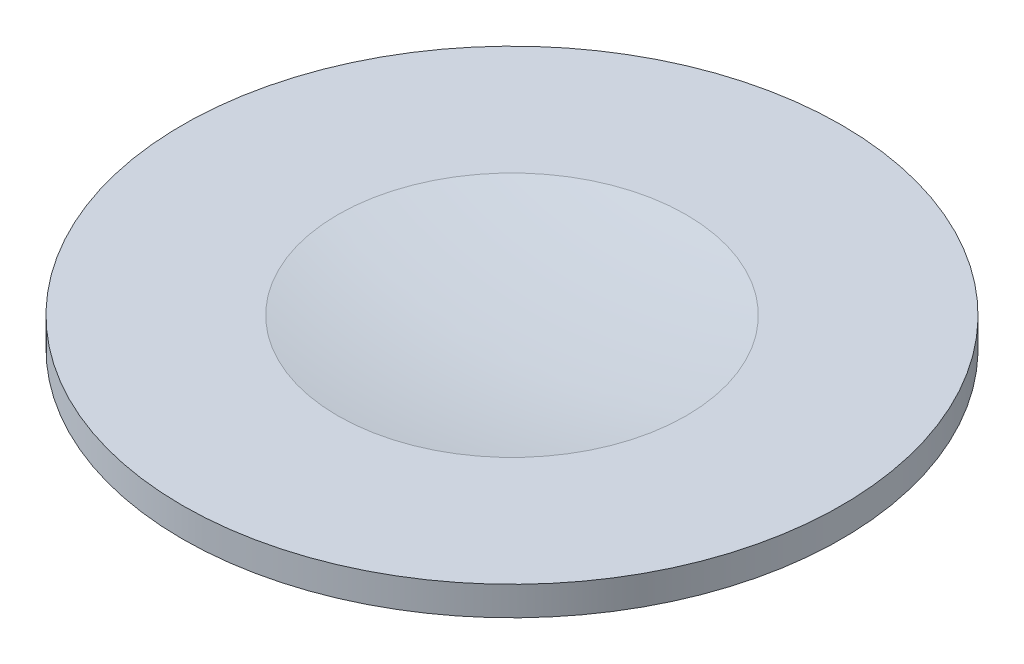
ISO-10303-21;
HEADER;
FILE_DESCRIPTION(('STEP AP214'),'2;1');
FILE_NAME('part.step','',(''),(''),'','','');
FILE_SCHEMA(('AUTOMOTIVE_DESIGN { 1 0 10303 214 1 1 1 1 }'));
ENDSEC;
DATA;
#1=APPLICATION_CONTEXT('core data for automotive mechanical design processes');
#2=APPLICATION_PROTOCOL_DEFINITION('international standard','automotive_design',2000,#1);
#3=PRODUCT_CONTEXT('',#1,'mechanical');
#4=PRODUCT('Part','Part','',(#3));
#5=PRODUCT_RELATED_PRODUCT_CATEGORY('part','',(#4));
#6=PRODUCT_DEFINITION_FORMATION('','',#4);
#7=PRODUCT_DEFINITION_CONTEXT('part definition',#1,'design');
#8=PRODUCT_DEFINITION('design','',#6,#7);
#9=PRODUCT_DEFINITION_SHAPE('','',#8);
#10=(LENGTH_UNIT() NAMED_UNIT(*) SI_UNIT(.MILLI.,.METRE.));
#11=(NAMED_UNIT(*) PLANE_ANGLE_UNIT() SI_UNIT($,.RADIAN.));
#12=(NAMED_UNIT(*) SI_UNIT($,.STERADIAN.) SOLID_ANGLE_UNIT());
#13=UNCERTAINTY_MEASURE_WITH_UNIT(LENGTH_MEASURE(1.E-05),#10,'distance_accuracy_value','');
#14=(GEOMETRIC_REPRESENTATION_CONTEXT(3) GLOBAL_UNCERTAINTY_ASSIGNED_CONTEXT((#13)) GLOBAL_UNIT_ASSIGNED_CONTEXT((#10,
#11,#12)) REPRESENTATION_CONTEXT('',''));
#15=CARTESIAN_POINT('',(0.,0.,0.));
#16=DIRECTION('',(0.,0.,1.));
#17=DIRECTION('',(1.,0.,0.));
#18=AXIS2_PLACEMENT_3D('',#15,#16,#17);
#19=CARTESIAN_POINT('',(0.,1.,0.));
#20=DIRECTION('',(0.,-1.,0.));
#21=DIRECTION('',(0.,0.,-1.));
#22=AXIS2_PLACEMENT_3D('',#19,#20,#21);
#23=CYLINDRICAL_SURFACE('',#22,11.35);
#24=CARTESIAN_POINT('',(0.,1.,0.));
#25=DIRECTION('',(0.,1.,0.));
#26=DIRECTION('',(0.,0.,1.));
#27=AXIS2_PLACEMENT_3D('',#24,#25,#26);
#28=CIRCLE('',#27,11.35);
#29=CARTESIAN_POINT('',(0.,1.,11.35));
#30=VERTEX_POINT('',#29);
#31=EDGE_CURVE('E10',#30,#30,#28,.T.);
#32=ORIENTED_EDGE('',*,*,#31,.F.);
#33=EDGE_LOOP('',(#32));
#34=FACE_BOUND('',#33,.T.);
#35=CARTESIAN_POINT('',(0.,0.,0.));
#36=DIRECTION('',(0.,1.,0.));
#37=DIRECTION('',(0.,0.,1.));
#38=AXIS2_PLACEMENT_3D('',#35,#36,#37);
#39=CIRCLE('',#38,11.35);
#40=CARTESIAN_POINT('',(0.,0.,11.35));
#41=VERTEX_POINT('',#40);
#42=EDGE_CURVE('E42',#41,#41,#39,.T.);
#43=ORIENTED_EDGE('',*,*,#42,.T.);
#44=EDGE_LOOP('',(#43));
#45=FACE_BOUND('',#44,.T.);
#46=ADVANCED_FACE('F39',(#34,#45),#23,.T.);
#47=CARTESIAN_POINT('',(0.,1.,0.));
#48=DIRECTION('',(0.,1.,0.));
#49=DIRECTION('',(0.,0.,1.));
#50=AXIS2_PLACEMENT_3D('',#47,#48,#49);
#51=PLANE('',#50);
#52=CARTESIAN_POINT('',(0.,1.,0.));
#53=DIRECTION('',(0.,1.,0.));
#54=DIRECTION('',(0.,0.,1.));
#55=AXIS2_PLACEMENT_3D('',#52,#53,#54);
#56=CIRCLE('',#55,6.);
#57=CARTESIAN_POINT('',(0.,1.,6.));
#58=VERTEX_POINT('',#57);
#59=EDGE_CURVE('E49',#58,#58,#56,.T.);
#60=ORIENTED_EDGE('',*,*,#59,.F.);
#61=EDGE_LOOP('',(#60));
#62=FACE_BOUND('',#61,.T.);
#63=ORIENTED_EDGE('',*,*,#31,.T.);
#64=EDGE_LOOP('',(#63));
#65=FACE_BOUND('',#64,.T.);
#66=ADVANCED_FACE('F56',(#62,#65),#51,.T.);
#67=CARTESIAN_POINT('',(0.,0.,0.));
#68=DIRECTION('',(0.,1.,0.));
#69=DIRECTION('',(0.,0.,1.));
#70=AXIS2_PLACEMENT_3D('',#67,#68,#69);
#71=PLANE('',#70);
#72=ORIENTED_EDGE('',*,*,#42,.F.);
#73=EDGE_LOOP('',(#72));
#74=FACE_BOUND('',#73,.T.);
#75=ADVANCED_FACE('F58',(#74),#71,.F.);
#76=CARTESIAN_POINT('',(0.,35.4818792991333,0.));
#77=DIRECTION('',(0.,1.,0.));
#78=DIRECTION('',(1.,0.,0.));
#79=AXIS2_PLACEMENT_3D('',#76,#77,#78);
#80=SPHERICAL_SURFACE('',#79,35.);
#81=ORIENTED_EDGE('',*,*,#59,.T.);
#82=EDGE_LOOP('',(#81));
#83=FACE_BOUND('',#82,.T.);
#84=ADVANCED_FACE('F54',(#83),#80,.F.);
#85=CLOSED_SHELL('',(#46,#66,#75,#84));
#86=MANIFOLD_SOLID_BREP('B2',#85);
#87=ADVANCED_BREP_SHAPE_REPRESENTATION('',(#18,#86),#14);
#88=SHAPE_DEFINITION_REPRESENTATION(#9,#87);
ENDSEC;
END-ISO-10303-21;
